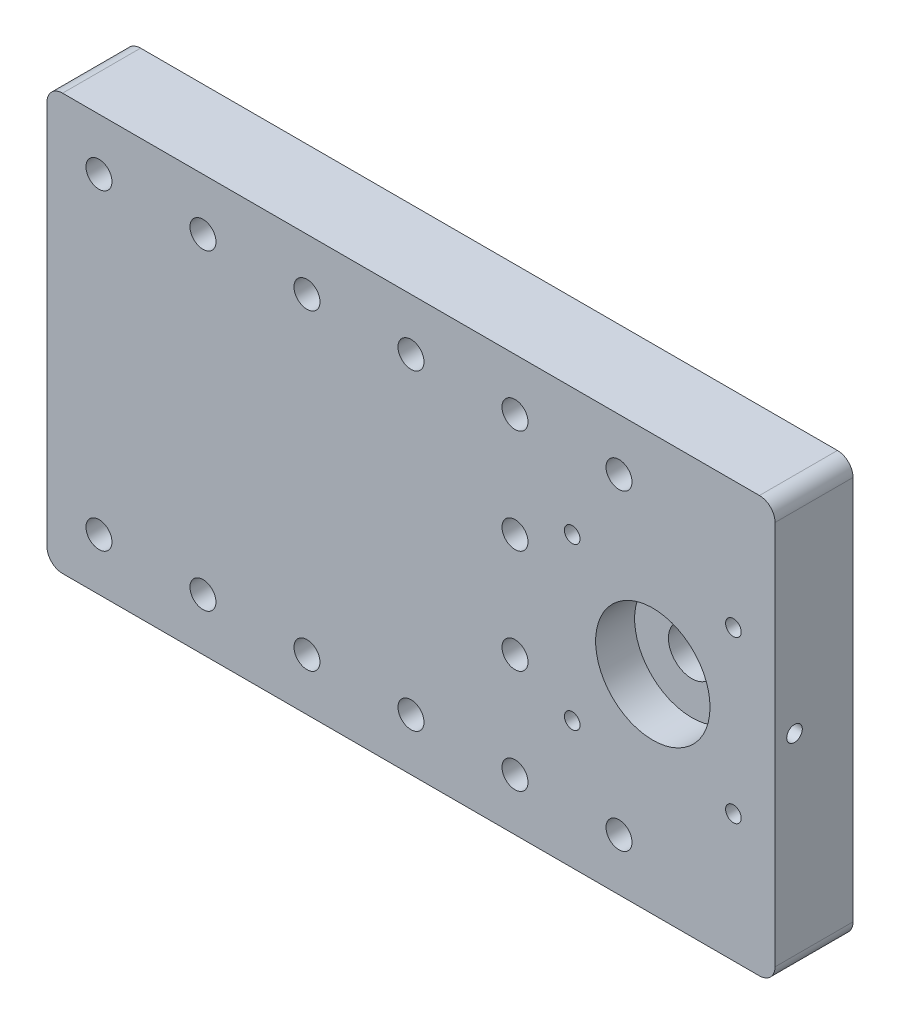
ISO-10303-21;
HEADER;
FILE_DESCRIPTION(('STEP AP214'),'2;1');
FILE_NAME('part.step','',(''),(''),'','','');
FILE_SCHEMA(('AUTOMOTIVE_DESIGN { 1 0 10303 214 1 1 1 1 }'));
ENDSEC;
DATA;
#1=APPLICATION_CONTEXT('core data for automotive mechanical design processes');
#2=APPLICATION_PROTOCOL_DEFINITION('international standard','automotive_design',2000,#1);
#3=PRODUCT_CONTEXT('',#1,'mechanical');
#4=PRODUCT('Part','Part','',(#3));
#5=PRODUCT_RELATED_PRODUCT_CATEGORY('part','',(#4));
#6=PRODUCT_DEFINITION_FORMATION('','',#4);
#7=PRODUCT_DEFINITION_CONTEXT('part definition',#1,'design');
#8=PRODUCT_DEFINITION('design','',#6,#7);
#9=PRODUCT_DEFINITION_SHAPE('','',#8);
#10=(LENGTH_UNIT() NAMED_UNIT(*) SI_UNIT(.MILLI.,.METRE.));
#11=(NAMED_UNIT(*) PLANE_ANGLE_UNIT() SI_UNIT($,.RADIAN.));
#12=(NAMED_UNIT(*) SI_UNIT($,.STERADIAN.) SOLID_ANGLE_UNIT());
#13=UNCERTAINTY_MEASURE_WITH_UNIT(LENGTH_MEASURE(1.E-05),#10,'distance_accuracy_value','');
#14=(GEOMETRIC_REPRESENTATION_CONTEXT(3) GLOBAL_UNCERTAINTY_ASSIGNED_CONTEXT((#13)) GLOBAL_UNIT_ASSIGNED_CONTEXT((#10,
#11,#12)) REPRESENTATION_CONTEXT('',''));
#15=CARTESIAN_POINT('',(0.,0.,0.));
#16=DIRECTION('',(0.,0.,1.));
#17=DIRECTION('',(1.,0.,0.));
#18=AXIS2_PLACEMENT_3D('',#15,#16,#17);
#19=CARTESIAN_POINT('',(0.,0.,15.));
#20=DIRECTION('',(0.,1.,0.));
#21=DIRECTION('',(0.,0.,1.));
#22=AXIS2_PLACEMENT_3D('',#19,#20,#21);
#23=PLANE('',#22);
#24=DIRECTION('',(1.,0.,0.));
#25=VECTOR('',#24,1.);
#26=CARTESIAN_POINT('',(0.,0.,15.));
#27=LINE('',#26,#25);
#28=CARTESIAN_POINT('',(-77.,0.,15.));
#29=VERTEX_POINT('',#28);
#30=CARTESIAN_POINT('',(57.,0.,15.));
#31=VERTEX_POINT('',#30);
#32=EDGE_CURVE('E135',#29,#31,#27,.T.);
#33=ORIENTED_EDGE('',*,*,#32,.F.);
#34=DIRECTION('',(0.,0.,-1.));
#35=VECTOR('',#34,1.);
#36=CARTESIAN_POINT('',(-77.,0.,15.));
#37=LINE('',#36,#35);
#38=CARTESIAN_POINT('',(-77.,0.,0.));
#39=VERTEX_POINT('',#38);
#40=EDGE_CURVE('E119',#29,#39,#37,.T.);
#41=ORIENTED_EDGE('',*,*,#40,.T.);
#42=DIRECTION('',(1.,0.,0.));
#43=VECTOR('',#42,1.);
#44=CARTESIAN_POINT('',(0.,0.,0.));
#45=LINE('',#44,#43);
#46=CARTESIAN_POINT('',(57.,0.,0.));
#47=VERTEX_POINT('',#46);
#48=EDGE_CURVE('E132',#39,#47,#45,.T.);
#49=ORIENTED_EDGE('',*,*,#48,.T.);
#50=DIRECTION('',(0.,0.,-1.));
#51=VECTOR('',#50,1.);
#52=CARTESIAN_POINT('',(57.,0.,15.));
#53=LINE('',#52,#51);
#54=EDGE_CURVE('E138',#47,#31,#53,.F.);
#55=ORIENTED_EDGE('',*,*,#54,.T.);
#56=EDGE_LOOP('',(#33,#41,#49,#55));
#57=FACE_BOUND('',#56,.T.);
#58=ADVANCED_FACE('F47',(#57),#23,.F.);
#59=CARTESIAN_POINT('',(60.,0.,15.));
#60=DIRECTION('',(-1.,0.,0.));
#61=DIRECTION('',(0.,0.,1.));
#62=AXIS2_PLACEMENT_3D('',#59,#60,#61);
#63=PLANE('',#62);
#64=CARTESIAN_POINT('',(60.,40.,11.25));
#65=DIRECTION('',(1.,0.,0.));
#66=DIRECTION('',(0.,0.,-1.));
#67=AXIS2_PLACEMENT_3D('',#64,#65,#66);
#68=CIRCLE('',#67,1.5);
#69=CARTESIAN_POINT('',(60.,40.,9.75));
#70=VERTEX_POINT('',#69);
#71=EDGE_CURVE('E426',#70,#70,#68,.T.);
#72=ORIENTED_EDGE('',*,*,#71,.F.);
#73=EDGE_LOOP('',(#72));
#74=FACE_BOUND('',#73,.T.);
#75=DIRECTION('',(0.,1.,0.));
#76=VECTOR('',#75,1.);
#77=CARTESIAN_POINT('',(60.,0.,15.));
#78=LINE('',#77,#76);
#79=CARTESIAN_POINT('',(60.,3.,15.));
#80=VERTEX_POINT('',#79);
#81=CARTESIAN_POINT('',(60.,77.,15.));
#82=VERTEX_POINT('',#81);
#83=EDGE_CURVE('E240',#80,#82,#78,.T.);
#84=ORIENTED_EDGE('',*,*,#83,.F.);
#85=DIRECTION('',(0.,0.,-1.));
#86=VECTOR('',#85,1.);
#87=CARTESIAN_POINT('',(60.,3.,15.));
#88=LINE('',#87,#86);
#89=CARTESIAN_POINT('',(60.,3.,0.));
#90=VERTEX_POINT('',#89);
#91=EDGE_CURVE('E12',#80,#90,#88,.T.);
#92=ORIENTED_EDGE('',*,*,#91,.T.);
#93=DIRECTION('',(0.,1.,0.));
#94=VECTOR('',#93,1.);
#95=CARTESIAN_POINT('',(60.,0.,0.));
#96=LINE('',#95,#94);
#97=CARTESIAN_POINT('',(60.,77.,0.));
#98=VERTEX_POINT('',#97);
#99=EDGE_CURVE('E145',#90,#98,#96,.T.);
#100=ORIENTED_EDGE('',*,*,#99,.T.);
#101=DIRECTION('',(0.,0.,-1.));
#102=VECTOR('',#101,1.);
#103=CARTESIAN_POINT('',(60.,77.,15.));
#104=LINE('',#103,#102);
#105=EDGE_CURVE('E56',#98,#82,#104,.F.);
#106=ORIENTED_EDGE('',*,*,#105,.T.);
#107=EDGE_LOOP('',(#84,#92,#100,#106));
#108=FACE_BOUND('',#107,.T.);
#109=ADVANCED_FACE('F239',(#74,#108),#63,.F.);
#110=CARTESIAN_POINT('',(0.,80.,15.));
#111=DIRECTION('',(0.,1.,0.));
#112=DIRECTION('',(0.,0.,1.));
#113=AXIS2_PLACEMENT_3D('',#110,#111,#112);
#114=PLANE('',#113);
#115=DIRECTION('',(1.,0.,0.));
#116=VECTOR('',#115,1.);
#117=CARTESIAN_POINT('',(0.,80.,0.));
#118=LINE('',#117,#116);
#119=CARTESIAN_POINT('',(-77.,80.,0.));
#120=VERTEX_POINT('',#119);
#121=CARTESIAN_POINT('',(57.,80.,0.));
#122=VERTEX_POINT('',#121);
#123=EDGE_CURVE('E153',#120,#122,#118,.T.);
#124=ORIENTED_EDGE('',*,*,#123,.F.);
#125=DIRECTION('',(0.,0.,-1.));
#126=VECTOR('',#125,1.);
#127=CARTESIAN_POINT('',(-77.,80.,15.));
#128=LINE('',#127,#126);
#129=CARTESIAN_POINT('',(-77.,80.,15.));
#130=VERTEX_POINT('',#129);
#131=EDGE_CURVE('E70',#120,#130,#128,.F.);
#132=ORIENTED_EDGE('',*,*,#131,.T.);
#133=DIRECTION('',(1.,0.,0.));
#134=VECTOR('',#133,1.);
#135=CARTESIAN_POINT('',(0.,80.,15.));
#136=LINE('',#135,#134);
#137=CARTESIAN_POINT('',(57.,80.,15.));
#138=VERTEX_POINT('',#137);
#139=EDGE_CURVE('E248',#130,#138,#136,.T.);
#140=ORIENTED_EDGE('',*,*,#139,.T.);
#141=DIRECTION('',(0.,0.,-1.));
#142=VECTOR('',#141,1.);
#143=CARTESIAN_POINT('',(57.,80.,0.));
#144=LINE('',#143,#142);
#145=EDGE_CURVE('E228',#138,#122,#144,.T.);
#146=ORIENTED_EDGE('',*,*,#145,.T.);
#147=EDGE_LOOP('',(#124,#132,#140,#146));
#148=FACE_BOUND('',#147,.T.);
#149=ADVANCED_FACE('F251',(#148),#114,.T.);
#150=CARTESIAN_POINT('',(-50.,70.,15.));
#151=DIRECTION('',(0.,0.,-1.));
#152=DIRECTION('',(-1.,0.,0.));
#153=AXIS2_PLACEMENT_3D('',#150,#151,#152);
#154=CYLINDRICAL_SURFACE('',#153,2.5);
#155=CARTESIAN_POINT('',(-50.,70.,15.));
#156=DIRECTION('',(0.,0.,1.));
#157=DIRECTION('',(1.,0.,0.));
#158=AXIS2_PLACEMENT_3D('',#155,#156,#157);
#159=CIRCLE('',#158,2.5);
#160=CARTESIAN_POINT('',(-47.5,70.,15.));
#161=VERTEX_POINT('',#160);
#162=EDGE_CURVE('E291',#161,#161,#159,.T.);
#163=ORIENTED_EDGE('',*,*,#162,.T.);
#164=EDGE_LOOP('',(#163));
#165=FACE_BOUND('',#164,.T.);
#166=CARTESIAN_POINT('',(-50.,70.,0.));
#167=DIRECTION('',(0.,0.,1.));
#168=DIRECTION('',(1.,0.,0.));
#169=AXIS2_PLACEMENT_3D('',#166,#167,#168);
#170=CIRCLE('',#169,2.5);
#171=CARTESIAN_POINT('',(-47.5,70.,0.));
#172=VERTEX_POINT('',#171);
#173=EDGE_CURVE('E191',#172,#172,#170,.T.);
#174=ORIENTED_EDGE('',*,*,#173,.F.);
#175=EDGE_LOOP('',(#174));
#176=FACE_BOUND('',#175,.T.);
#177=ADVANCED_FACE('F362',(#165,#176),#154,.F.);
#178=CARTESIAN_POINT('',(-30.,70.,15.));
#179=DIRECTION('',(0.,0.,-1.));
#180=DIRECTION('',(-1.,0.,0.));
#181=AXIS2_PLACEMENT_3D('',#178,#179,#180);
#182=CYLINDRICAL_SURFACE('',#181,2.5);
#183=CARTESIAN_POINT('',(-30.,70.,15.));
#184=DIRECTION('',(0.,0.,1.));
#185=DIRECTION('',(1.,0.,0.));
#186=AXIS2_PLACEMENT_3D('',#183,#184,#185);
#187=CIRCLE('',#186,2.5);
#188=CARTESIAN_POINT('',(-27.5,70.,15.));
#189=VERTEX_POINT('',#188);
#190=EDGE_CURVE('E287',#189,#189,#187,.T.);
#191=ORIENTED_EDGE('',*,*,#190,.T.);
#192=EDGE_LOOP('',(#191));
#193=FACE_BOUND('',#192,.T.);
#194=CARTESIAN_POINT('',(-30.,70.,0.));
#195=DIRECTION('',(0.,0.,1.));
#196=DIRECTION('',(1.,0.,0.));
#197=AXIS2_PLACEMENT_3D('',#194,#195,#196);
#198=CIRCLE('',#197,2.5);
#199=CARTESIAN_POINT('',(-27.5,70.,0.));
#200=VERTEX_POINT('',#199);
#201=EDGE_CURVE('E187',#200,#200,#198,.T.);
#202=ORIENTED_EDGE('',*,*,#201,.F.);
#203=EDGE_LOOP('',(#202));
#204=FACE_BOUND('',#203,.T.);
#205=ADVANCED_FACE('F384',(#193,#204),#182,.F.);
#206=CARTESIAN_POINT('',(-10.,70.,15.));
#207=DIRECTION('',(0.,0.,-1.));
#208=DIRECTION('',(-1.,0.,0.));
#209=AXIS2_PLACEMENT_3D('',#206,#207,#208);
#210=CYLINDRICAL_SURFACE('',#209,2.5);
#211=CARTESIAN_POINT('',(-10.,70.,15.));
#212=DIRECTION('',(0.,0.,1.));
#213=DIRECTION('',(1.,0.,0.));
#214=AXIS2_PLACEMENT_3D('',#211,#212,#213);
#215=CIRCLE('',#214,2.5);
#216=CARTESIAN_POINT('',(-7.5,70.,15.));
#217=VERTEX_POINT('',#216);
#218=EDGE_CURVE('E283',#217,#217,#215,.T.);
#219=ORIENTED_EDGE('',*,*,#218,.T.);
#220=EDGE_LOOP('',(#219));
#221=FACE_BOUND('',#220,.T.);
#222=CARTESIAN_POINT('',(-10.,70.,0.));
#223=DIRECTION('',(0.,0.,1.));
#224=DIRECTION('',(1.,0.,0.));
#225=AXIS2_PLACEMENT_3D('',#222,#223,#224);
#226=CIRCLE('',#225,2.5);
#227=CARTESIAN_POINT('',(-7.5,70.,0.));
#228=VERTEX_POINT('',#227);
#229=EDGE_CURVE('E183',#228,#228,#226,.T.);
#230=ORIENTED_EDGE('',*,*,#229,.F.);
#231=EDGE_LOOP('',(#230));
#232=FACE_BOUND('',#231,.T.);
#233=ADVANCED_FACE('F380',(#221,#232),#210,.F.);
#234=CARTESIAN_POINT('',(-70.,10.,15.));
#235=DIRECTION('',(0.,0.,-1.));
#236=DIRECTION('',(-1.,0.,0.));
#237=AXIS2_PLACEMENT_3D('',#234,#235,#236);
#238=CYLINDRICAL_SURFACE('',#237,2.5);
#239=CARTESIAN_POINT('',(-70.,10.,15.));
#240=DIRECTION('',(0.,0.,1.));
#241=DIRECTION('',(1.,0.,0.));
#242=AXIS2_PLACEMENT_3D('',#239,#240,#241);
#243=CIRCLE('',#242,2.5);
#244=CARTESIAN_POINT('',(-67.5,10.,15.));
#245=VERTEX_POINT('',#244);
#246=EDGE_CURVE('E279',#245,#245,#243,.T.);
#247=ORIENTED_EDGE('',*,*,#246,.T.);
#248=EDGE_LOOP('',(#247));
#249=FACE_BOUND('',#248,.T.);
#250=CARTESIAN_POINT('',(-70.,10.,0.));
#251=DIRECTION('',(0.,0.,1.));
#252=DIRECTION('',(1.,0.,0.));
#253=AXIS2_PLACEMENT_3D('',#250,#251,#252);
#254=CIRCLE('',#253,2.5);
#255=CARTESIAN_POINT('',(-67.5,10.,0.));
#256=VERTEX_POINT('',#255);
#257=EDGE_CURVE('E179',#256,#256,#254,.T.);
#258=ORIENTED_EDGE('',*,*,#257,.F.);
#259=EDGE_LOOP('',(#258));
#260=FACE_BOUND('',#259,.T.);
#261=ADVANCED_FACE('F376',(#249,#260),#238,.F.);
#262=CARTESIAN_POINT('',(-50.,10.,15.));
#263=DIRECTION('',(0.,0.,-1.));
#264=DIRECTION('',(-1.,0.,0.));
#265=AXIS2_PLACEMENT_3D('',#262,#263,#264);
#266=CYLINDRICAL_SURFACE('',#265,2.5);
#267=CARTESIAN_POINT('',(-50.,10.,15.));
#268=DIRECTION('',(0.,0.,1.));
#269=DIRECTION('',(1.,0.,0.));
#270=AXIS2_PLACEMENT_3D('',#267,#268,#269);
#271=CIRCLE('',#270,2.5);
#272=CARTESIAN_POINT('',(-47.5,10.,15.));
#273=VERTEX_POINT('',#272);
#274=EDGE_CURVE('E275',#273,#273,#271,.T.);
#275=ORIENTED_EDGE('',*,*,#274,.T.);
#276=EDGE_LOOP('',(#275));
#277=FACE_BOUND('',#276,.T.);
#278=CARTESIAN_POINT('',(-50.,10.,0.));
#279=DIRECTION('',(0.,0.,1.));
#280=DIRECTION('',(1.,0.,0.));
#281=AXIS2_PLACEMENT_3D('',#278,#279,#280);
#282=CIRCLE('',#281,2.5);
#283=CARTESIAN_POINT('',(-47.5,10.,0.));
#284=VERTEX_POINT('',#283);
#285=EDGE_CURVE('E175',#284,#284,#282,.T.);
#286=ORIENTED_EDGE('',*,*,#285,.F.);
#287=EDGE_LOOP('',(#286));
#288=FACE_BOUND('',#287,.T.);
#289=ADVANCED_FACE('F372',(#277,#288),#266,.F.);
#290=CARTESIAN_POINT('',(-30.,10.,15.));
#291=DIRECTION('',(0.,0.,-1.));
#292=DIRECTION('',(-1.,0.,0.));
#293=AXIS2_PLACEMENT_3D('',#290,#291,#292);
#294=CYLINDRICAL_SURFACE('',#293,2.5);
#295=CARTESIAN_POINT('',(-30.,10.,15.));
#296=DIRECTION('',(0.,0.,1.));
#297=DIRECTION('',(1.,0.,0.));
#298=AXIS2_PLACEMENT_3D('',#295,#296,#297);
#299=CIRCLE('',#298,2.5);
#300=CARTESIAN_POINT('',(-27.5,10.,15.));
#301=VERTEX_POINT('',#300);
#302=EDGE_CURVE('E267',#301,#301,#299,.T.);
#303=ORIENTED_EDGE('',*,*,#302,.T.);
#304=EDGE_LOOP('',(#303));
#305=FACE_BOUND('',#304,.T.);
#306=CARTESIAN_POINT('',(-30.,10.,0.));
#307=DIRECTION('',(0.,0.,1.));
#308=DIRECTION('',(1.,0.,0.));
#309=AXIS2_PLACEMENT_3D('',#306,#307,#308);
#310=CIRCLE('',#309,2.5);
#311=CARTESIAN_POINT('',(-27.5,10.,0.));
#312=VERTEX_POINT('',#311);
#313=EDGE_CURVE('E171',#312,#312,#310,.T.);
#314=ORIENTED_EDGE('',*,*,#313,.F.);
#315=EDGE_LOOP('',(#314));
#316=FACE_BOUND('',#315,.T.);
#317=ADVANCED_FACE('F368',(#305,#316),#294,.F.);
#318=CARTESIAN_POINT('',(-10.,10.,15.));
#319=DIRECTION('',(0.,0.,-1.));
#320=DIRECTION('',(-1.,0.,0.));
#321=AXIS2_PLACEMENT_3D('',#318,#319,#320);
#322=CYLINDRICAL_SURFACE('',#321,2.5);
#323=CARTESIAN_POINT('',(-10.,10.,15.));
#324=DIRECTION('',(0.,0.,1.));
#325=DIRECTION('',(1.,0.,0.));
#326=AXIS2_PLACEMENT_3D('',#323,#324,#325);
#327=CIRCLE('',#326,2.5);
#328=CARTESIAN_POINT('',(-7.5,10.,15.));
#329=VERTEX_POINT('',#328);
#330=EDGE_CURVE('E261',#329,#329,#327,.T.);
#331=ORIENTED_EDGE('',*,*,#330,.T.);
#332=EDGE_LOOP('',(#331));
#333=FACE_BOUND('',#332,.T.);
#334=CARTESIAN_POINT('',(-10.,10.,0.));
#335=DIRECTION('',(0.,0.,1.));
#336=DIRECTION('',(1.,0.,0.));
#337=AXIS2_PLACEMENT_3D('',#334,#335,#336);
#338=CIRCLE('',#337,2.5);
#339=CARTESIAN_POINT('',(-7.5,10.,0.));
#340=VERTEX_POINT('',#339);
#341=EDGE_CURVE('E167',#340,#340,#338,.T.);
#342=ORIENTED_EDGE('',*,*,#341,.F.);
#343=EDGE_LOOP('',(#342));
#344=FACE_BOUND('',#343,.T.);
#345=ADVANCED_FACE('F365',(#333,#344),#322,.F.);
#346=CARTESIAN_POINT('',(-80.,0.,15.));
#347=DIRECTION('',(1.,0.,0.));
#348=DIRECTION('',(0.,0.,-1.));
#349=AXIS2_PLACEMENT_3D('',#346,#347,#348);
#350=PLANE('',#349);
#351=DIRECTION('',(0.,-1.,0.));
#352=VECTOR('',#351,1.);
#353=CARTESIAN_POINT('',(-80.,0.,0.));
#354=LINE('',#353,#352);
#355=CARTESIAN_POINT('',(-80.,77.,0.));
#356=VERTEX_POINT('',#355);
#357=CARTESIAN_POINT('',(-80.,3.,0.));
#358=VERTEX_POINT('',#357);
#359=EDGE_CURVE('E164',#356,#358,#354,.T.);
#360=ORIENTED_EDGE('',*,*,#359,.T.);
#361=DIRECTION('',(0.,0.,-1.));
#362=VECTOR('',#361,1.);
#363=CARTESIAN_POINT('',(-80.,3.,15.));
#364=LINE('',#363,#362);
#365=CARTESIAN_POINT('',(-80.,3.,15.));
#366=VERTEX_POINT('',#365);
#367=EDGE_CURVE('E120',#358,#366,#364,.F.);
#368=ORIENTED_EDGE('',*,*,#367,.T.);
#369=DIRECTION('',(0.,-1.,0.));
#370=VECTOR('',#369,1.);
#371=CARTESIAN_POINT('',(-80.,0.,15.));
#372=LINE('',#371,#370);
#373=CARTESIAN_POINT('',(-80.,77.,15.));
#374=VERTEX_POINT('',#373);
#375=EDGE_CURVE('E259',#374,#366,#372,.T.);
#376=ORIENTED_EDGE('',*,*,#375,.F.);
#377=DIRECTION('',(0.,0.,-1.));
#378=VECTOR('',#377,1.);
#379=CARTESIAN_POINT('',(-80.,77.,0.));
#380=LINE('',#379,#378);
#381=EDGE_CURVE('E126',#374,#356,#380,.T.);
#382=ORIENTED_EDGE('',*,*,#381,.T.);
#383=EDGE_LOOP('',(#360,#368,#376,#382));
#384=FACE_BOUND('',#383,.T.);
#385=ADVANCED_FACE('F258',(#384),#350,.F.);
#386=CARTESIAN_POINT('',(10.,10.,15.));
#387=DIRECTION('',(0.,0.,-1.));
#388=DIRECTION('',(-1.,0.,0.));
#389=AXIS2_PLACEMENT_3D('',#386,#387,#388);
#390=CYLINDRICAL_SURFACE('',#389,2.5);
#391=CARTESIAN_POINT('',(10.,10.,15.));
#392=DIRECTION('',(0.,0.,1.));
#393=DIRECTION('',(1.,0.,0.));
#394=AXIS2_PLACEMENT_3D('',#391,#392,#393);
#395=CIRCLE('',#394,2.5);
#396=CARTESIAN_POINT('',(12.5,10.,15.));
#397=VERTEX_POINT('',#396);
#398=EDGE_CURVE('E471',#397,#397,#395,.T.);
#399=ORIENTED_EDGE('',*,*,#398,.T.);
#400=EDGE_LOOP('',(#399));
#401=FACE_BOUND('',#400,.T.);
#402=CARTESIAN_POINT('',(10.,10.,0.));
#403=DIRECTION('',(0.,0.,1.));
#404=DIRECTION('',(1.,0.,0.));
#405=AXIS2_PLACEMENT_3D('',#402,#403,#404);
#406=CIRCLE('',#405,2.5);
#407=CARTESIAN_POINT('',(12.5,10.,0.));
#408=VERTEX_POINT('',#407);
#409=EDGE_CURVE('E146',#408,#408,#406,.T.);
#410=ORIENTED_EDGE('',*,*,#409,.F.);
#411=EDGE_LOOP('',(#410));
#412=FACE_BOUND('',#411,.T.);
#413=ADVANCED_FACE('F339',(#401,#412),#390,.F.);
#414=CARTESIAN_POINT('',(10.,30.,15.));
#415=DIRECTION('',(0.,0.,-1.));
#416=DIRECTION('',(-1.,0.,0.));
#417=AXIS2_PLACEMENT_3D('',#414,#415,#416);
#418=CYLINDRICAL_SURFACE('',#417,2.5);
#419=CARTESIAN_POINT('',(10.,30.,15.));
#420=DIRECTION('',(0.,0.,1.));
#421=DIRECTION('',(1.,0.,0.));
#422=AXIS2_PLACEMENT_3D('',#419,#420,#421);
#423=CIRCLE('',#422,2.5);
#424=CARTESIAN_POINT('',(12.5,30.,15.));
#425=VERTEX_POINT('',#424);
#426=EDGE_CURVE('E468',#425,#425,#423,.T.);
#427=ORIENTED_EDGE('',*,*,#426,.T.);
#428=EDGE_LOOP('',(#427));
#429=FACE_BOUND('',#428,.T.);
#430=CARTESIAN_POINT('',(10.,30.,0.));
#431=DIRECTION('',(0.,0.,1.));
#432=DIRECTION('',(1.,0.,0.));
#433=AXIS2_PLACEMENT_3D('',#430,#431,#432);
#434=CIRCLE('',#433,2.5);
#435=CARTESIAN_POINT('',(12.5,30.,0.));
#436=VERTEX_POINT('',#435);
#437=EDGE_CURVE('E157',#436,#436,#434,.T.);
#438=ORIENTED_EDGE('',*,*,#437,.F.);
#439=EDGE_LOOP('',(#438));
#440=FACE_BOUND('',#439,.T.);
#441=ADVANCED_FACE('F336',(#429,#440),#418,.F.);
#442=CARTESIAN_POINT('',(10.,50.,15.));
#443=DIRECTION('',(0.,0.,-1.));
#444=DIRECTION('',(-1.,0.,0.));
#445=AXIS2_PLACEMENT_3D('',#442,#443,#444);
#446=CYLINDRICAL_SURFACE('',#445,2.5);
#447=CARTESIAN_POINT('',(10.,50.,15.));
#448=DIRECTION('',(0.,0.,1.));
#449=DIRECTION('',(1.,0.,0.));
#450=AXIS2_PLACEMENT_3D('',#447,#448,#449);
#451=CIRCLE('',#450,2.5);
#452=CARTESIAN_POINT('',(12.5,50.,15.));
#453=VERTEX_POINT('',#452);
#454=EDGE_CURVE('E464',#453,#453,#451,.T.);
#455=ORIENTED_EDGE('',*,*,#454,.T.);
#456=EDGE_LOOP('',(#455));
#457=FACE_BOUND('',#456,.T.);
#458=CARTESIAN_POINT('',(10.,50.,0.));
#459=DIRECTION('',(0.,0.,1.));
#460=DIRECTION('',(1.,0.,0.));
#461=AXIS2_PLACEMENT_3D('',#458,#459,#460);
#462=CIRCLE('',#461,2.5);
#463=CARTESIAN_POINT('',(12.5,50.,0.));
#464=VERTEX_POINT('',#463);
#465=EDGE_CURVE('E326',#464,#464,#462,.T.);
#466=ORIENTED_EDGE('',*,*,#465,.F.);
#467=EDGE_LOOP('',(#466));
#468=FACE_BOUND('',#467,.T.);
#469=ADVANCED_FACE('F338',(#457,#468),#446,.F.);
#470=CARTESIAN_POINT('',(10.,70.,15.));
#471=DIRECTION('',(0.,0.,-1.));
#472=DIRECTION('',(-1.,0.,0.));
#473=AXIS2_PLACEMENT_3D('',#470,#471,#472);
#474=CYLINDRICAL_SURFACE('',#473,2.5);
#475=CARTESIAN_POINT('',(10.,70.,15.));
#476=DIRECTION('',(0.,0.,1.));
#477=DIRECTION('',(1.,0.,0.));
#478=AXIS2_PLACEMENT_3D('',#475,#476,#477);
#479=CIRCLE('',#478,2.5);
#480=CARTESIAN_POINT('',(12.5,70.,15.));
#481=VERTEX_POINT('',#480);
#482=EDGE_CURVE('E460',#481,#481,#479,.T.);
#483=ORIENTED_EDGE('',*,*,#482,.T.);
#484=EDGE_LOOP('',(#483));
#485=FACE_BOUND('',#484,.T.);
#486=CARTESIAN_POINT('',(10.,70.,0.));
#487=DIRECTION('',(0.,0.,1.));
#488=DIRECTION('',(1.,0.,0.));
#489=AXIS2_PLACEMENT_3D('',#486,#487,#488);
#490=CIRCLE('',#489,2.5);
#491=CARTESIAN_POINT('',(12.5,70.,0.));
#492=VERTEX_POINT('',#491);
#493=EDGE_CURVE('E323',#492,#492,#490,.T.);
#494=ORIENTED_EDGE('',*,*,#493,.F.);
#495=EDGE_LOOP('',(#494));
#496=FACE_BOUND('',#495,.T.);
#497=ADVANCED_FACE('F346',(#485,#496),#474,.F.);
#498=CARTESIAN_POINT('',(30.,70.,15.));
#499=DIRECTION('',(0.,0.,-1.));
#500=DIRECTION('',(-1.,0.,0.));
#501=AXIS2_PLACEMENT_3D('',#498,#499,#500);
#502=CYLINDRICAL_SURFACE('',#501,2.5);
#503=CARTESIAN_POINT('',(30.,70.,15.));
#504=DIRECTION('',(0.,0.,1.));
#505=DIRECTION('',(1.,0.,0.));
#506=AXIS2_PLACEMENT_3D('',#503,#504,#505);
#507=CIRCLE('',#506,2.5);
#508=CARTESIAN_POINT('',(32.5,70.,15.));
#509=VERTEX_POINT('',#508);
#510=EDGE_CURVE('E456',#509,#509,#507,.T.);
#511=ORIENTED_EDGE('',*,*,#510,.T.);
#512=EDGE_LOOP('',(#511));
#513=FACE_BOUND('',#512,.T.);
#514=CARTESIAN_POINT('',(30.,70.,0.));
#515=DIRECTION('',(0.,0.,1.));
#516=DIRECTION('',(1.,0.,0.));
#517=AXIS2_PLACEMENT_3D('',#514,#515,#516);
#518=CIRCLE('',#517,2.5);
#519=CARTESIAN_POINT('',(32.5,70.,0.));
#520=VERTEX_POINT('',#519);
#521=EDGE_CURVE('E319',#520,#520,#518,.T.);
#522=ORIENTED_EDGE('',*,*,#521,.F.);
#523=EDGE_LOOP('',(#522));
#524=FACE_BOUND('',#523,.T.);
#525=ADVANCED_FACE('F509',(#513,#524),#502,.F.);
#526=CARTESIAN_POINT('',(30.,10.,15.));
#527=DIRECTION('',(0.,0.,-1.));
#528=DIRECTION('',(-1.,0.,0.));
#529=AXIS2_PLACEMENT_3D('',#526,#527,#528);
#530=CYLINDRICAL_SURFACE('',#529,2.5);
#531=CARTESIAN_POINT('',(30.,10.,15.));
#532=DIRECTION('',(0.,0.,1.));
#533=DIRECTION('',(1.,0.,0.));
#534=AXIS2_PLACEMENT_3D('',#531,#532,#533);
#535=CIRCLE('',#534,2.5);
#536=CARTESIAN_POINT('',(32.5,10.,15.));
#537=VERTEX_POINT('',#536);
#538=EDGE_CURVE('E452',#537,#537,#535,.T.);
#539=ORIENTED_EDGE('',*,*,#538,.T.);
#540=EDGE_LOOP('',(#539));
#541=FACE_BOUND('',#540,.T.);
#542=CARTESIAN_POINT('',(30.,10.,0.));
#543=DIRECTION('',(0.,0.,1.));
#544=DIRECTION('',(1.,0.,0.));
#545=AXIS2_PLACEMENT_3D('',#542,#543,#544);
#546=CIRCLE('',#545,2.5);
#547=CARTESIAN_POINT('',(32.5,10.,0.));
#548=VERTEX_POINT('',#547);
#549=EDGE_CURVE('E315',#548,#548,#546,.T.);
#550=ORIENTED_EDGE('',*,*,#549,.F.);
#551=EDGE_LOOP('',(#550));
#552=FACE_BOUND('',#551,.T.);
#553=ADVANCED_FACE('F505',(#541,#552),#530,.F.);
#554=CARTESIAN_POINT('',(36.5,40.,15.));
#555=DIRECTION('',(0.,0.,-1.));
#556=DIRECTION('',(-1.,0.,0.));
#557=AXIS2_PLACEMENT_3D('',#554,#555,#556);
#558=CYLINDRICAL_SURFACE('',#557,11.);
#559=CARTESIAN_POINT('',(47.5,40.,9.75));
#560=CARTESIAN_POINT('',(47.4999987467262,40.0838384134299,9.75000351945738));
#561=CARTESIAN_POINT('',(47.4990314271488,40.1677276022898,9.75705259267256));
#562=CARTESIAN_POINT('',(47.4952656640845,40.3331670976414,9.78505888322428));
#563=CARTESIAN_POINT('',(47.492465364401,40.4147149456599,9.80603019944984));
#564=CARTESIAN_POINT('',(47.4853487739829,40.5730530936936,9.86124773384062));
#565=CARTESIAN_POINT('',(47.4810335583919,40.6498467224532,9.89548453920208));
#566=CARTESIAN_POINT('',(47.471365727223,40.7965853024497,9.97623952456021));
#567=CARTESIAN_POINT('',(47.4660132749006,40.8665313288587,10.0227557722543));
#568=CARTESIAN_POINT('',(47.4548285996925,40.9980575638122,10.1270722142923));
#569=CARTESIAN_POINT('',(47.4489937690522,41.0595867846238,10.1849364230035));
#570=CARTESIAN_POINT('',(47.4375227155932,41.1720933390804,10.3101686107924));
#571=CARTESIAN_POINT('',(47.4318865034525,41.223070106128,10.3775370998613));
#572=CARTESIAN_POINT('',(47.4214253777188,41.3132185052492,10.5202019382241));
#573=CARTESIAN_POINT('',(47.416603830108,41.352341664684,10.5955291850052));
#574=CARTESIAN_POINT('',(47.4083529406776,41.4173626448528,10.7517618153737));
#575=CARTESIAN_POINT('',(47.404923536173,41.4432610610799,10.8326669476098));
#576=CARTESIAN_POINT('',(47.3998704969217,41.4809409055509,10.9972262435736));
#577=CARTESIAN_POINT('',(47.3982357822449,41.4928089886455,11.0808602192911));
#578=CARTESIAN_POINT('',(47.3969234380482,41.5023595505967,11.2489474730241));
#579=CARTESIAN_POINT('',(47.3972457153308,41.5000427049798,11.3334007118328));
#580=CARTESIAN_POINT('',(47.3998008033656,41.4813601701924,11.5001217256009));
#581=CARTESIAN_POINT('',(47.4020205710196,41.4650903891759,11.5824004763672));
#582=CARTESIAN_POINT('',(47.4081001740818,41.419113676953,11.7430490405326));
#583=CARTESIAN_POINT('',(47.411960048455,41.3894064265025,11.821418761013));
#584=CARTESIAN_POINT('',(47.420899582937,41.3172964176021,11.9723199260376));
#585=CARTESIAN_POINT('',(47.4259831927575,41.2748524385776,12.044831429268));
#586=CARTESIAN_POINT('',(47.4367944433469,41.1785032304482,12.1817391488858));
#587=CARTESIAN_POINT('',(47.4425221191218,41.1245973782304,12.2461349237667));
#588=CARTESIAN_POINT('',(47.454033973898,41.006325277838,12.3655395544946));
#589=CARTESIAN_POINT('',(47.4598182294108,40.9418764507342,12.4204666403124));
#590=CARTESIAN_POINT('',(47.4707474705779,40.8046309444054,12.5187364915984));
#591=CARTESIAN_POINT('',(47.4758924542398,40.7318342391646,12.562079220963));
#592=CARTESIAN_POINT('',(47.4849675408771,40.5798929694804,12.63595186318));
#593=CARTESIAN_POINT('',(47.4888971094847,40.5007456321313,12.6664761423927));
#594=CARTESIAN_POINT('',(47.4950939520307,40.3383830879399,12.7137778379456));
#595=CARTESIAN_POINT('',(47.497361318692,40.2551681082801,12.7305560210935));
#596=CARTESIAN_POINT('',(47.4999661380375,40.0877389073677,12.7497820845656));
#597=CARTESIAN_POINT('',(47.5003187469014,40.0035378363878,12.7523425085886));
#598=CARTESIAN_POINT('',(47.4990953877098,39.8359077059107,12.7433581216693));
#599=CARTESIAN_POINT('',(47.4975194687383,39.7524786268196,12.7318136697171));
#600=CARTESIAN_POINT('',(47.4926255265792,39.5890966216351,12.6950407767903));
#601=CARTESIAN_POINT('',(47.4893144012332,39.5091312793794,12.6698665044287));
#602=CARTESIAN_POINT('',(47.4813204406363,39.3545568589044,12.6066052409671));
#603=CARTESIAN_POINT('',(47.4766375509031,39.2799479935748,12.5685177369828));
#604=CARTESIAN_POINT('',(47.4663836303603,39.1377051070175,12.480242461276));
#605=CARTESIAN_POINT('',(47.460807370571,39.0701162716468,12.4299824971996));
#606=CARTESIAN_POINT('',(47.4494055314268,38.9442929867454,12.3188904220426));
#607=CARTESIAN_POINT('',(47.4435799402192,38.8860589825467,12.2580578079433));
#608=CARTESIAN_POINT('',(47.4322886877303,38.7801946704589,12.1270491669916));
#609=CARTESIAN_POINT('',(47.4268257501214,38.7326393361936,12.0568122865189));
#610=CARTESIAN_POINT('',(47.4169246504416,38.6500016045074,11.9092816923002));
#611=CARTESIAN_POINT('',(47.4124864646235,38.6149189180386,11.8319881421414));
#612=CARTESIAN_POINT('',(47.4051564726067,38.5583415049485,11.6727722433268));
#613=CARTESIAN_POINT('',(47.402259998972,38.5368057294999,11.5908647055639));
#614=CARTESIAN_POINT('',(47.3983284316023,38.5078018945248,11.424553478172));
#615=CARTESIAN_POINT('',(47.3972932333409,38.500333045021,11.3401499289856));
#616=CARTESIAN_POINT('',(47.3972048541528,38.4996914341528,11.171989024609));
#617=CARTESIAN_POINT('',(47.3981353386205,38.5064008530936,11.0882321033916));
#618=CARTESIAN_POINT('',(47.4018382005365,38.5336745356147,10.9230488613015));
#619=CARTESIAN_POINT('',(47.4046105769335,38.5542387912881,10.8416225390988));
#620=CARTESIAN_POINT('',(47.4116795081979,38.6085994354952,10.6834348606149));
#621=CARTESIAN_POINT('',(47.4159752803929,38.6423890301931,10.6066711325175));
#622=CARTESIAN_POINT('',(47.425608111245,38.7222296016088,10.4598837013936));
#623=CARTESIAN_POINT('',(47.4309451926623,38.7682808463418,10.3898601457394));
#624=CARTESIAN_POINT('',(47.4421122992185,38.8717708477692,10.2579399634002));
#625=CARTESIAN_POINT('',(47.4479459056036,38.929297215766,10.1961123637775));
#626=CARTESIAN_POINT('',(47.4594178730356,39.0539201319464,10.0829446532892));
#627=CARTESIAN_POINT('',(47.4650561880416,39.1210189180421,10.0316070016886));
#628=CARTESIAN_POINT('',(47.4755309296992,39.263234506798,9.94067403261664));
#629=CARTESIAN_POINT('',(47.4803636164562,39.3383861814826,9.90113284172368));
#630=CARTESIAN_POINT('',(47.4886453705716,39.4942903060697,9.83529051894702));
#631=CARTESIAN_POINT('',(47.4920959102772,39.5750366879781,9.8089752903063));
#632=CARTESIAN_POINT('',(47.4964117606731,39.7134814029128,9.77648956293605));
#633=CARTESIAN_POINT('',(47.4977506427886,39.7703142113039,9.76657063920265));
#634=CARTESIAN_POINT('',(47.4995451890738,39.8847566863531,9.75332467901879));
#635=CARTESIAN_POINT('',(47.5000008615472,39.9423663457023,9.74999758059365));
#636=CARTESIAN_POINT('',(47.5,40.,9.75));
#637=B_SPLINE_CURVE_WITH_KNOTS('',3,(#559,#560,#561,#562,#563,#564,#565,#566,#567,#568,#569,
#570,#571,#572,#573,#574,#575,#576,#577,#578,#579,#580,#581,#582,#583,#584,#585,#586,#587,#588,
#589,#590,#591,#592,#593,#594,#595,#596,#597,#598,#599,#600,#601,#602,#603,#604,#605,#606,#607,
#608,#609,#610,#611,#612,#613,#614,#615,#616,#617,#618,#619,#620,#621,#622,#623,#624,#625,#626,
#627,#628,#629,#630,#631,#632,#633,#634,#635,#636),.UNSPECIFIED.,.T.,.F.,(4,2,2,2,2,2,2,2,2,2,2,
2,2,2,2,2,2,2,2,2,2,2,2,2,2,2,2,2,2,2,2,2,2,2,2,2,2,2,4),(0.,0.251304688086158,
0.502864258429492,0.754245655375312,1.00558751830524,1.25839025869503,1.51120656941611,
1.76504317927172,2.01886835818389,2.27111752000617,2.52335466910191,2.77387178872724,
3.02439486038874,3.27573762185034,3.52709405079554,3.7805228474684,4.03395243396009,
4.28749328511462,4.5410199918667,4.79253696204824,5.04404753088008,5.29456578809542,
5.54509399649482,5.79714607697891,6.04921015271753,6.30299215129407,6.55676826820729,
6.80977166004952,7.06276084317859,7.3136559874506,7.56455098853991,7.8153172740624,
8.06608904128419,8.31885423544368,8.57167862009409,8.82564582024677,9.07934175494258,
9.25209960062622,9.42485582207673),.UNSPECIFIED.);
#638=CARTESIAN_POINT('',(47.5,40.,9.75));
#639=VERTEX_POINT('',#638);
#640=EDGE_CURVE('E418',#639,#639,#637,.T.);
#641=ORIENTED_EDGE('',*,*,#640,.T.);
#642=EDGE_LOOP('',(#641));
#643=FACE_BOUND('',#642,.T.);
#644=CARTESIAN_POINT('',(36.5,40.,7.5));
#645=DIRECTION('',(0.,0.,1.));
#646=DIRECTION('',(1.,0.,0.));
#647=AXIS2_PLACEMENT_3D('',#644,#645,#646);
#648=CIRCLE('',#647,11.);
#649=CARTESIAN_POINT('',(47.5,40.,7.5));
#650=VERTEX_POINT('',#649);
#651=EDGE_CURVE('E199',#650,#650,#648,.T.);
#652=ORIENTED_EDGE('',*,*,#651,.F.);
#653=EDGE_LOOP('',(#652));
#654=FACE_BOUND('',#653,.T.);
#655=CARTESIAN_POINT('',(36.5,40.,15.));
#656=DIRECTION('',(0.,0.,1.));
#657=DIRECTION('',(1.,0.,0.));
#658=AXIS2_PLACEMENT_3D('',#655,#656,#657);
#659=CIRCLE('',#658,11.);
#660=CARTESIAN_POINT('',(47.5,40.,15.));
#661=VERTEX_POINT('',#660);
#662=EDGE_CURVE('E448',#661,#661,#659,.T.);
#663=ORIENTED_EDGE('',*,*,#662,.T.);
#664=EDGE_LOOP('',(#663));
#665=FACE_BOUND('',#664,.T.);
#666=ADVANCED_FACE('F501',(#643,#654,#665),#558,.F.);
#667=CARTESIAN_POINT('',(21.,55.5,15.));
#668=DIRECTION('',(0.,0.,-1.));
#669=DIRECTION('',(-1.,0.,0.));
#670=AXIS2_PLACEMENT_3D('',#667,#668,#669);
#671=CYLINDRICAL_SURFACE('',#670,1.5);
#672=CARTESIAN_POINT('',(21.,55.5,15.));
#673=DIRECTION('',(0.,0.,1.));
#674=DIRECTION('',(1.,0.,0.));
#675=AXIS2_PLACEMENT_3D('',#672,#673,#674);
#676=CIRCLE('',#675,1.5);
#677=CARTESIAN_POINT('',(22.5,55.5,15.));
#678=VERTEX_POINT('',#677);
#679=EDGE_CURVE('E444',#678,#678,#676,.T.);
#680=ORIENTED_EDGE('',*,*,#679,.T.);
#681=EDGE_LOOP('',(#680));
#682=FACE_BOUND('',#681,.T.);
#683=CARTESIAN_POINT('',(21.,55.5,0.));
#684=DIRECTION('',(0.,0.,1.));
#685=DIRECTION('',(1.,0.,0.));
#686=AXIS2_PLACEMENT_3D('',#683,#684,#685);
#687=CIRCLE('',#686,1.5);
#688=CARTESIAN_POINT('',(22.5,55.5,0.));
#689=VERTEX_POINT('',#688);
#690=EDGE_CURVE('E311',#689,#689,#687,.T.);
#691=ORIENTED_EDGE('',*,*,#690,.F.);
#692=EDGE_LOOP('',(#691));
#693=FACE_BOUND('',#692,.T.);
#694=ADVANCED_FACE('F497',(#682,#693),#671,.F.);
#695=CARTESIAN_POINT('',(52.,55.5,15.));
#696=DIRECTION('',(0.,0.,-1.));
#697=DIRECTION('',(-1.,0.,0.));
#698=AXIS2_PLACEMENT_3D('',#695,#696,#697);
#699=CYLINDRICAL_SURFACE('',#698,1.5);
#700=CARTESIAN_POINT('',(52.,55.5,15.));
#701=DIRECTION('',(0.,0.,1.));
#702=DIRECTION('',(1.,0.,0.));
#703=AXIS2_PLACEMENT_3D('',#700,#701,#702);
#704=CIRCLE('',#703,1.5);
#705=CARTESIAN_POINT('',(53.5,55.5,15.));
#706=VERTEX_POINT('',#705);
#707=EDGE_CURVE('E440',#706,#706,#704,.T.);
#708=ORIENTED_EDGE('',*,*,#707,.T.);
#709=EDGE_LOOP('',(#708));
#710=FACE_BOUND('',#709,.T.);
#711=CARTESIAN_POINT('',(52.,55.5,0.));
#712=DIRECTION('',(0.,0.,1.));
#713=DIRECTION('',(1.,0.,0.));
#714=AXIS2_PLACEMENT_3D('',#711,#712,#713);
#715=CIRCLE('',#714,1.5);
#716=CARTESIAN_POINT('',(53.5,55.5,0.));
#717=VERTEX_POINT('',#716);
#718=EDGE_CURVE('E307',#717,#717,#715,.T.);
#719=ORIENTED_EDGE('',*,*,#718,.F.);
#720=EDGE_LOOP('',(#719));
#721=FACE_BOUND('',#720,.T.);
#722=ADVANCED_FACE('F493',(#710,#721),#699,.F.);
#723=CARTESIAN_POINT('',(52.,24.5,15.));
#724=DIRECTION('',(0.,0.,-1.));
#725=DIRECTION('',(-1.,0.,0.));
#726=AXIS2_PLACEMENT_3D('',#723,#724,#725);
#727=CYLINDRICAL_SURFACE('',#726,1.5);
#728=CARTESIAN_POINT('',(52.,24.5,15.));
#729=DIRECTION('',(0.,0.,1.));
#730=DIRECTION('',(1.,0.,0.));
#731=AXIS2_PLACEMENT_3D('',#728,#729,#730);
#732=CIRCLE('',#731,1.5);
#733=CARTESIAN_POINT('',(53.5,24.5,15.));
#734=VERTEX_POINT('',#733);
#735=EDGE_CURVE('E436',#734,#734,#732,.T.);
#736=ORIENTED_EDGE('',*,*,#735,.T.);
#737=EDGE_LOOP('',(#736));
#738=FACE_BOUND('',#737,.T.);
#739=CARTESIAN_POINT('',(52.,24.5,0.));
#740=DIRECTION('',(0.,0.,1.));
#741=DIRECTION('',(1.,0.,0.));
#742=AXIS2_PLACEMENT_3D('',#739,#740,#741);
#743=CIRCLE('',#742,1.5);
#744=CARTESIAN_POINT('',(53.5,24.5,0.));
#745=VERTEX_POINT('',#744);
#746=EDGE_CURVE('E302',#745,#745,#743,.T.);
#747=ORIENTED_EDGE('',*,*,#746,.F.);
#748=EDGE_LOOP('',(#747));
#749=FACE_BOUND('',#748,.T.);
#750=ADVANCED_FACE('F489',(#738,#749),#727,.F.);
#751=CARTESIAN_POINT('',(21.,24.5,15.));
#752=DIRECTION('',(0.,0.,-1.));
#753=DIRECTION('',(-1.,0.,0.));
#754=AXIS2_PLACEMENT_3D('',#751,#752,#753);
#755=CYLINDRICAL_SURFACE('',#754,1.5);
#756=CARTESIAN_POINT('',(21.,24.5,15.));
#757=DIRECTION('',(0.,0.,1.));
#758=DIRECTION('',(1.,0.,0.));
#759=AXIS2_PLACEMENT_3D('',#756,#757,#758);
#760=CIRCLE('',#759,1.5);
#761=CARTESIAN_POINT('',(22.5,24.5,15.));
#762=VERTEX_POINT('',#761);
#763=EDGE_CURVE('E198',#762,#762,#760,.T.);
#764=ORIENTED_EDGE('',*,*,#763,.T.);
#765=EDGE_LOOP('',(#764));
#766=FACE_BOUND('',#765,.T.);
#767=CARTESIAN_POINT('',(21.,24.5,0.));
#768=DIRECTION('',(0.,0.,1.));
#769=DIRECTION('',(1.,0.,0.));
#770=AXIS2_PLACEMENT_3D('',#767,#768,#769);
#771=CIRCLE('',#770,1.5);
#772=CARTESIAN_POINT('',(22.5,24.5,0.));
#773=VERTEX_POINT('',#772);
#774=EDGE_CURVE('E298',#773,#773,#771,.T.);
#775=ORIENTED_EDGE('',*,*,#774,.F.);
#776=EDGE_LOOP('',(#775));
#777=FACE_BOUND('',#776,.T.);
#778=ADVANCED_FACE('F395',(#766,#777),#755,.F.);
#779=CARTESIAN_POINT('',(-70.,70.,15.));
#780=DIRECTION('',(0.,0.,-1.));
#781=DIRECTION('',(-1.,0.,0.));
#782=AXIS2_PLACEMENT_3D('',#779,#780,#781);
#783=CYLINDRICAL_SURFACE('',#782,2.5);
#784=CARTESIAN_POINT('',(-70.,70.,15.));
#785=DIRECTION('',(0.,0.,1.));
#786=DIRECTION('',(1.,0.,0.));
#787=AXIS2_PLACEMENT_3D('',#784,#785,#786);
#788=CIRCLE('',#787,2.5);
#789=CARTESIAN_POINT('',(-67.5,70.,15.));
#790=VERTEX_POINT('',#789);
#791=EDGE_CURVE('E203',#790,#790,#788,.T.);
#792=ORIENTED_EDGE('',*,*,#791,.T.);
#793=EDGE_LOOP('',(#792));
#794=FACE_BOUND('',#793,.T.);
#795=CARTESIAN_POINT('',(-70.,70.,0.));
#796=DIRECTION('',(0.,0.,1.));
#797=DIRECTION('',(1.,0.,0.));
#798=AXIS2_PLACEMENT_3D('',#795,#796,#797);
#799=CIRCLE('',#798,2.5);
#800=CARTESIAN_POINT('',(-67.5,70.,0.));
#801=VERTEX_POINT('',#800);
#802=EDGE_CURVE('E194',#801,#801,#799,.T.);
#803=ORIENTED_EDGE('',*,*,#802,.F.);
#804=EDGE_LOOP('',(#803));
#805=FACE_BOUND('',#804,.T.);
#806=ADVANCED_FACE('F392',(#794,#805),#783,.F.);
#807=CARTESIAN_POINT('',(0.,0.,15.));
#808=DIRECTION('',(0.,0.,1.));
#809=DIRECTION('',(1.,0.,0.));
#810=AXIS2_PLACEMENT_3D('',#807,#808,#809);
#811=PLANE('',#810);
#812=ORIENTED_EDGE('',*,*,#763,.F.);
#813=EDGE_LOOP('',(#812));
#814=FACE_BOUND('',#813,.T.);
#815=ORIENTED_EDGE('',*,*,#735,.F.);
#816=EDGE_LOOP('',(#815));
#817=FACE_BOUND('',#816,.T.);
#818=ORIENTED_EDGE('',*,*,#707,.F.);
#819=EDGE_LOOP('',(#818));
#820=FACE_BOUND('',#819,.T.);
#821=ORIENTED_EDGE('',*,*,#679,.F.);
#822=EDGE_LOOP('',(#821));
#823=FACE_BOUND('',#822,.T.);
#824=ORIENTED_EDGE('',*,*,#662,.F.);
#825=EDGE_LOOP('',(#824));
#826=FACE_BOUND('',#825,.T.);
#827=ORIENTED_EDGE('',*,*,#538,.F.);
#828=EDGE_LOOP('',(#827));
#829=FACE_BOUND('',#828,.T.);
#830=ORIENTED_EDGE('',*,*,#510,.F.);
#831=EDGE_LOOP('',(#830));
#832=FACE_BOUND('',#831,.T.);
#833=ORIENTED_EDGE('',*,*,#482,.F.);
#834=EDGE_LOOP('',(#833));
#835=FACE_BOUND('',#834,.T.);
#836=ORIENTED_EDGE('',*,*,#454,.F.);
#837=EDGE_LOOP('',(#836));
#838=FACE_BOUND('',#837,.T.);
#839=ORIENTED_EDGE('',*,*,#426,.F.);
#840=EDGE_LOOP('',(#839));
#841=FACE_BOUND('',#840,.T.);
#842=ORIENTED_EDGE('',*,*,#398,.F.);
#843=EDGE_LOOP('',(#842));
#844=FACE_BOUND('',#843,.T.);
#845=ORIENTED_EDGE('',*,*,#375,.T.);
#846=CARTESIAN_POINT('',(-77.,3.,15.));
#847=DIRECTION('',(0.,0.,1.));
#848=DIRECTION('',(1.,0.,0.));
#849=AXIS2_PLACEMENT_3D('',#846,#847,#848);
#850=CIRCLE('',#849,3.);
#851=EDGE_CURVE('E225',#366,#29,#850,.T.);
#852=ORIENTED_EDGE('',*,*,#851,.T.);
#853=ORIENTED_EDGE('',*,*,#32,.T.);
#854=CARTESIAN_POINT('',(57.,3.,15.));
#855=DIRECTION('',(0.,0.,1.));
#856=DIRECTION('',(1.,0.,0.));
#857=AXIS2_PLACEMENT_3D('',#854,#855,#856);
#858=CIRCLE('',#857,3.);
#859=EDGE_CURVE('E219',#31,#80,#858,.T.);
#860=ORIENTED_EDGE('',*,*,#859,.T.);
#861=ORIENTED_EDGE('',*,*,#83,.T.);
#862=CARTESIAN_POINT('',(57.,77.,15.));
#863=DIRECTION('',(0.,0.,1.));
#864=DIRECTION('',(1.,0.,0.));
#865=AXIS2_PLACEMENT_3D('',#862,#863,#864);
#866=CIRCLE('',#865,3.);
#867=EDGE_CURVE('E63',#82,#138,#866,.T.);
#868=ORIENTED_EDGE('',*,*,#867,.T.);
#869=ORIENTED_EDGE('',*,*,#139,.F.);
#870=CARTESIAN_POINT('',(-77.,77.,15.));
#871=DIRECTION('',(0.,0.,1.));
#872=DIRECTION('',(1.,0.,0.));
#873=AXIS2_PLACEMENT_3D('',#870,#871,#872);
#874=CIRCLE('',#873,3.);
#875=EDGE_CURVE('E222',#130,#374,#874,.T.);
#876=ORIENTED_EDGE('',*,*,#875,.T.);
#877=EDGE_LOOP('',(#845,#852,#853,#860,#861,#868,#869,#876));
#878=FACE_BOUND('',#877,.T.);
#879=ORIENTED_EDGE('',*,*,#330,.F.);
#880=EDGE_LOOP('',(#879));
#881=FACE_BOUND('',#880,.T.);
#882=ORIENTED_EDGE('',*,*,#302,.F.);
#883=EDGE_LOOP('',(#882));
#884=FACE_BOUND('',#883,.T.);
#885=ORIENTED_EDGE('',*,*,#274,.F.);
#886=EDGE_LOOP('',(#885));
#887=FACE_BOUND('',#886,.T.);
#888=ORIENTED_EDGE('',*,*,#246,.F.);
#889=EDGE_LOOP('',(#888));
#890=FACE_BOUND('',#889,.T.);
#891=ORIENTED_EDGE('',*,*,#218,.F.);
#892=EDGE_LOOP('',(#891));
#893=FACE_BOUND('',#892,.T.);
#894=ORIENTED_EDGE('',*,*,#190,.F.);
#895=EDGE_LOOP('',(#894));
#896=FACE_BOUND('',#895,.T.);
#897=ORIENTED_EDGE('',*,*,#162,.F.);
#898=EDGE_LOOP('',(#897));
#899=FACE_BOUND('',#898,.T.);
#900=ORIENTED_EDGE('',*,*,#791,.F.);
#901=EDGE_LOOP('',(#900));
#902=FACE_BOUND('',#901,.T.);
#903=ADVANCED_FACE('F244',(#814,#817,#820,#823,#826,#829,#832,#835,#838,#841,#844,#878,#881,
#884,#887,#890,#893,#896,#899,#902),#811,.T.);
#904=CARTESIAN_POINT('',(0.,0.,0.));
#905=DIRECTION('',(0.,0.,1.));
#906=DIRECTION('',(1.,0.,0.));
#907=AXIS2_PLACEMENT_3D('',#904,#905,#906);
#908=PLANE('',#907);
#909=ORIENTED_EDGE('',*,*,#774,.T.);
#910=EDGE_LOOP('',(#909));
#911=FACE_BOUND('',#910,.T.);
#912=ORIENTED_EDGE('',*,*,#746,.T.);
#913=EDGE_LOOP('',(#912));
#914=FACE_BOUND('',#913,.T.);
#915=ORIENTED_EDGE('',*,*,#718,.T.);
#916=EDGE_LOOP('',(#915));
#917=FACE_BOUND('',#916,.T.);
#918=ORIENTED_EDGE('',*,*,#690,.T.);
#919=EDGE_LOOP('',(#918));
#920=FACE_BOUND('',#919,.T.);
#921=ORIENTED_EDGE('',*,*,#549,.T.);
#922=EDGE_LOOP('',(#921));
#923=FACE_BOUND('',#922,.T.);
#924=ORIENTED_EDGE('',*,*,#521,.T.);
#925=EDGE_LOOP('',(#924));
#926=FACE_BOUND('',#925,.T.);
#927=ORIENTED_EDGE('',*,*,#493,.T.);
#928=EDGE_LOOP('',(#927));
#929=FACE_BOUND('',#928,.T.);
#930=ORIENTED_EDGE('',*,*,#465,.T.);
#931=EDGE_LOOP('',(#930));
#932=FACE_BOUND('',#931,.T.);
#933=ORIENTED_EDGE('',*,*,#437,.T.);
#934=EDGE_LOOP('',(#933));
#935=FACE_BOUND('',#934,.T.);
#936=ORIENTED_EDGE('',*,*,#409,.T.);
#937=EDGE_LOOP('',(#936));
#938=FACE_BOUND('',#937,.T.);
#939=ORIENTED_EDGE('',*,*,#48,.F.);
#940=CARTESIAN_POINT('',(-77.,3.,0.));
#941=DIRECTION('',(0.,0.,1.));
#942=DIRECTION('',(1.,0.,0.));
#943=AXIS2_PLACEMENT_3D('',#940,#941,#942);
#944=CIRCLE('',#943,3.);
#945=EDGE_CURVE('E115',#39,#358,#944,.F.);
#946=ORIENTED_EDGE('',*,*,#945,.T.);
#947=ORIENTED_EDGE('',*,*,#359,.F.);
#948=CARTESIAN_POINT('',(-77.,77.,0.));
#949=DIRECTION('',(0.,0.,1.));
#950=DIRECTION('',(1.,0.,0.));
#951=AXIS2_PLACEMENT_3D('',#948,#949,#950);
#952=CIRCLE('',#951,3.);
#953=EDGE_CURVE('E127',#356,#120,#952,.F.);
#954=ORIENTED_EDGE('',*,*,#953,.T.);
#955=ORIENTED_EDGE('',*,*,#123,.T.);
#956=CARTESIAN_POINT('',(57.,77.,0.));
#957=DIRECTION('',(0.,0.,1.));
#958=DIRECTION('',(1.,0.,0.));
#959=AXIS2_PLACEMENT_3D('',#956,#957,#958);
#960=CIRCLE('',#959,3.);
#961=EDGE_CURVE('E137',#122,#98,#960,.F.);
#962=ORIENTED_EDGE('',*,*,#961,.T.);
#963=ORIENTED_EDGE('',*,*,#99,.F.);
#964=CARTESIAN_POINT('',(57.,3.,0.));
#965=DIRECTION('',(0.,0.,1.));
#966=DIRECTION('',(1.,0.,0.));
#967=AXIS2_PLACEMENT_3D('',#964,#965,#966);
#968=CIRCLE('',#967,3.);
#969=EDGE_CURVE('E143',#90,#47,#968,.F.);
#970=ORIENTED_EDGE('',*,*,#969,.T.);
#971=EDGE_LOOP('',(#939,#946,#947,#954,#955,#962,#963,#970));
#972=FACE_BOUND('',#971,.T.);
#973=ORIENTED_EDGE('',*,*,#341,.T.);
#974=EDGE_LOOP('',(#973));
#975=FACE_BOUND('',#974,.T.);
#976=ORIENTED_EDGE('',*,*,#313,.T.);
#977=EDGE_LOOP('',(#976));
#978=FACE_BOUND('',#977,.T.);
#979=ORIENTED_EDGE('',*,*,#285,.T.);
#980=EDGE_LOOP('',(#979));
#981=FACE_BOUND('',#980,.T.);
#982=ORIENTED_EDGE('',*,*,#257,.T.);
#983=EDGE_LOOP('',(#982));
#984=FACE_BOUND('',#983,.T.);
#985=ORIENTED_EDGE('',*,*,#229,.T.);
#986=EDGE_LOOP('',(#985));
#987=FACE_BOUND('',#986,.T.);
#988=ORIENTED_EDGE('',*,*,#201,.T.);
#989=EDGE_LOOP('',(#988));
#990=FACE_BOUND('',#989,.T.);
#991=ORIENTED_EDGE('',*,*,#173,.T.);
#992=EDGE_LOOP('',(#991));
#993=FACE_BOUND('',#992,.T.);
#994=ORIENTED_EDGE('',*,*,#802,.T.);
#995=EDGE_LOOP('',(#994));
#996=FACE_BOUND('',#995,.T.);
#997=CARTESIAN_POINT('',(36.5,40.,0.));
#998=DIRECTION('',(0.,0.,1.));
#999=DIRECTION('',(1.,0.,0.));
#1000=AXIS2_PLACEMENT_3D('',#997,#998,#999);
#1001=CIRCLE('',#1000,4.5);
#1002=CARTESIAN_POINT('',(41.,40.,0.));
#1003=VERTEX_POINT('',#1002);
#1004=EDGE_CURVE('E303',#1003,#1003,#1001,.T.);
#1005=ORIENTED_EDGE('',*,*,#1004,.T.);
#1006=EDGE_LOOP('',(#1005));
#1007=FACE_BOUND('',#1006,.T.);
#1008=ADVANCED_FACE('F140',(#911,#914,#917,#920,#923,#926,#929,#932,#935,#938,#972,#975,#978,
#981,#984,#987,#990,#993,#996,#1007),#908,.F.);
#1009=CARTESIAN_POINT('',(36.5,40.,46.1126983722081));
#1010=DIRECTION('',(0.,0.,-1.));
#1011=DIRECTION('',(-1.,0.,0.));
#1012=AXIS2_PLACEMENT_3D('',#1009,#1010,#1011);
#1013=CYLINDRICAL_SURFACE('',#1012,4.5);
#1014=ORIENTED_EDGE('',*,*,#1004,.F.);
#1015=EDGE_LOOP('',(#1014));
#1016=FACE_BOUND('',#1015,.T.);
#1017=CARTESIAN_POINT('',(36.5,40.,7.5));
#1018=DIRECTION('',(0.,0.,1.));
#1019=DIRECTION('',(1.,0.,0.));
#1020=AXIS2_PLACEMENT_3D('',#1017,#1018,#1019);
#1021=CIRCLE('',#1020,4.5);
#1022=CARTESIAN_POINT('',(41.,40.,7.5));
#1023=VERTEX_POINT('',#1022);
#1024=EDGE_CURVE('E430',#1023,#1023,#1021,.T.);
#1025=ORIENTED_EDGE('',*,*,#1024,.T.);
#1026=EDGE_LOOP('',(#1025));
#1027=FACE_BOUND('',#1026,.T.);
#1028=ADVANCED_FACE('F399',(#1016,#1027),#1013,.F.);
#1029=CARTESIAN_POINT('',(0.,0.,7.5));
#1030=DIRECTION('',(0.,0.,1.));
#1031=DIRECTION('',(1.,0.,0.));
#1032=AXIS2_PLACEMENT_3D('',#1029,#1030,#1031);
#1033=PLANE('',#1032);
#1034=ORIENTED_EDGE('',*,*,#1024,.F.);
#1035=EDGE_LOOP('',(#1034));
#1036=FACE_BOUND('',#1035,.T.);
#1037=ORIENTED_EDGE('',*,*,#651,.T.);
#1038=EDGE_LOOP('',(#1037));
#1039=FACE_BOUND('',#1038,.T.);
#1040=ADVANCED_FACE('F404',(#1036,#1039),#1033,.T.);
#1041=CARTESIAN_POINT('',(-77.,3.,15.));
#1042=DIRECTION('',(0.,0.,-1.));
#1043=DIRECTION('',(-1.,0.,0.));
#1044=AXIS2_PLACEMENT_3D('',#1041,#1042,#1043);
#1045=CYLINDRICAL_SURFACE('',#1044,3.);
#1046=ORIENTED_EDGE('',*,*,#851,.F.);
#1047=ORIENTED_EDGE('',*,*,#367,.F.);
#1048=ORIENTED_EDGE('',*,*,#945,.F.);
#1049=ORIENTED_EDGE('',*,*,#40,.F.);
#1050=EDGE_LOOP('',(#1046,#1047,#1048,#1049));
#1051=FACE_BOUND('',#1050,.T.);
#1052=ADVANCED_FACE('F118',(#1051),#1045,.T.);
#1053=CARTESIAN_POINT('',(-77.,77.,15.));
#1054=DIRECTION('',(0.,0.,1.));
#1055=DIRECTION('',(1.,0.,0.));
#1056=AXIS2_PLACEMENT_3D('',#1053,#1054,#1055);
#1057=CYLINDRICAL_SURFACE('',#1056,3.);
#1058=ORIENTED_EDGE('',*,*,#875,.F.);
#1059=ORIENTED_EDGE('',*,*,#131,.F.);
#1060=ORIENTED_EDGE('',*,*,#953,.F.);
#1061=ORIENTED_EDGE('',*,*,#381,.F.);
#1062=EDGE_LOOP('',(#1058,#1059,#1060,#1061));
#1063=FACE_BOUND('',#1062,.T.);
#1064=ADVANCED_FACE('F255',(#1063),#1057,.T.);
#1065=CARTESIAN_POINT('',(57.,3.,15.));
#1066=DIRECTION('',(0.,0.,-1.));
#1067=DIRECTION('',(-1.,0.,0.));
#1068=AXIS2_PLACEMENT_3D('',#1065,#1066,#1067);
#1069=CYLINDRICAL_SURFACE('',#1068,3.);
#1070=ORIENTED_EDGE('',*,*,#859,.F.);
#1071=ORIENTED_EDGE('',*,*,#54,.F.);
#1072=ORIENTED_EDGE('',*,*,#969,.F.);
#1073=ORIENTED_EDGE('',*,*,#91,.F.);
#1074=EDGE_LOOP('',(#1070,#1071,#1072,#1073));
#1075=FACE_BOUND('',#1074,.T.);
#1076=ADVANCED_FACE('F477',(#1075),#1069,.T.);
#1077=CARTESIAN_POINT('',(57.,77.,15.));
#1078=DIRECTION('',(0.,0.,1.));
#1079=DIRECTION('',(1.,0.,0.));
#1080=AXIS2_PLACEMENT_3D('',#1077,#1078,#1079);
#1081=CYLINDRICAL_SURFACE('',#1080,3.);
#1082=ORIENTED_EDGE('',*,*,#867,.F.);
#1083=ORIENTED_EDGE('',*,*,#105,.F.);
#1084=ORIENTED_EDGE('',*,*,#961,.F.);
#1085=ORIENTED_EDGE('',*,*,#145,.F.);
#1086=EDGE_LOOP('',(#1082,#1083,#1084,#1085));
#1087=FACE_BOUND('',#1086,.T.);
#1088=ADVANCED_FACE('F49',(#1087),#1081,.T.);
#1089=CARTESIAN_POINT('',(-80.001,40.,11.25));
#1090=DIRECTION('',(1.,0.,0.));
#1091=DIRECTION('',(0.,0.,-1.));
#1092=AXIS2_PLACEMENT_3D('',#1089,#1090,#1091);
#1093=CYLINDRICAL_SURFACE('',#1092,1.5);
#1094=ORIENTED_EDGE('',*,*,#640,.F.);
#1095=EDGE_LOOP('',(#1094));
#1096=FACE_BOUND('',#1095,.T.);
#1097=ORIENTED_EDGE('',*,*,#71,.T.);
#1098=EDGE_LOOP('',(#1097));
#1099=FACE_BOUND('',#1098,.T.);
#1100=ADVANCED_FACE('F411',(#1096,#1099),#1093,.F.);
#1101=CLOSED_SHELL('',(#58,#109,#149,#177,#205,#233,#261,#289,#317,#345,#385,#413,#441,#469,
#497,#525,#553,#666,#694,#722,#750,#778,#806,#903,#1008,#1028,#1040,#1052,#1064,#1076,#1088,#1100));
#1102=MANIFOLD_SOLID_BREP('B2',#1101);
#1103=ADVANCED_BREP_SHAPE_REPRESENTATION('',(#18,#1102),#14);
#1104=SHAPE_DEFINITION_REPRESENTATION(#9,#1103);
ENDSEC;
END-ISO-10303-21;
